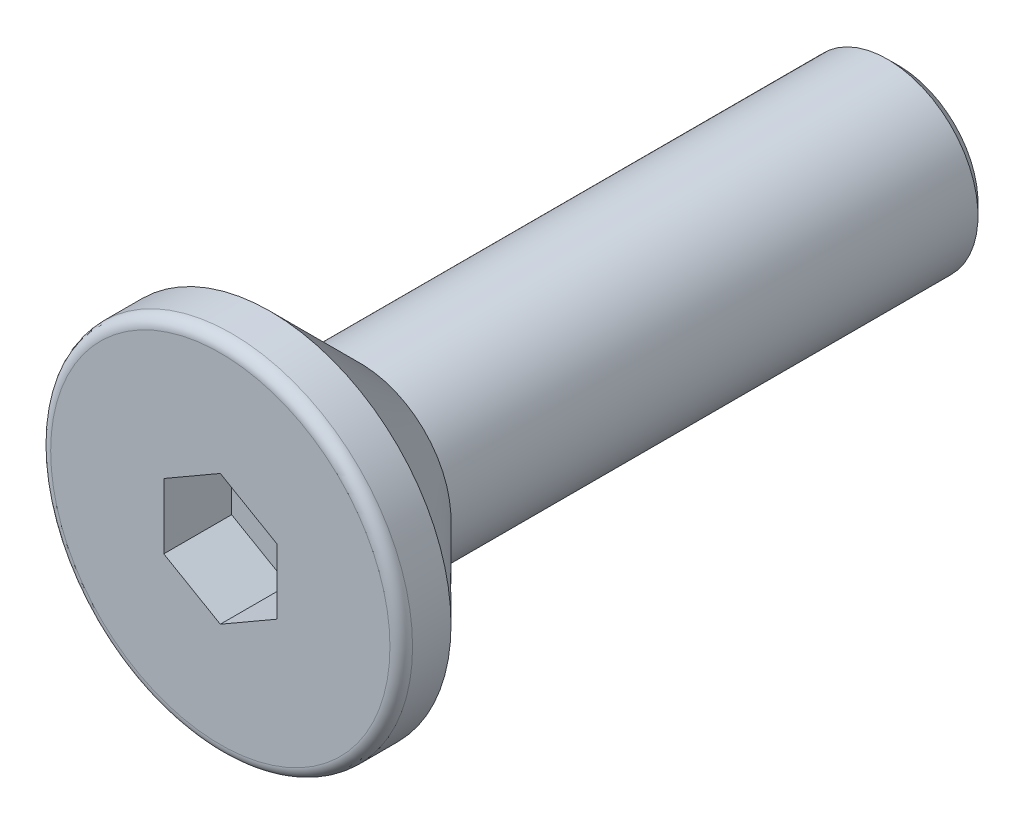
ISO-10303-21;
HEADER;
FILE_DESCRIPTION(('STEP AP214'),'2;1');
FILE_NAME('part.step','',(''),(''),'','','');
FILE_SCHEMA(('AUTOMOTIVE_DESIGN { 1 0 10303 214 1 1 1 1 }'));
ENDSEC;
DATA;
#1=APPLICATION_CONTEXT('core data for automotive mechanical design processes');
#2=APPLICATION_PROTOCOL_DEFINITION('international standard','automotive_design',2000,#1);
#3=PRODUCT_CONTEXT('',#1,'mechanical');
#4=PRODUCT('Part','Part','',(#3));
#5=PRODUCT_RELATED_PRODUCT_CATEGORY('part','',(#4));
#6=PRODUCT_DEFINITION_FORMATION('','',#4);
#7=PRODUCT_DEFINITION_CONTEXT('part definition',#1,'design');
#8=PRODUCT_DEFINITION('design','',#6,#7);
#9=PRODUCT_DEFINITION_SHAPE('','',#8);
#10=(LENGTH_UNIT() NAMED_UNIT(*) SI_UNIT(.MILLI.,.METRE.));
#11=(NAMED_UNIT(*) PLANE_ANGLE_UNIT() SI_UNIT($,.RADIAN.));
#12=(NAMED_UNIT(*) SI_UNIT($,.STERADIAN.) SOLID_ANGLE_UNIT());
#13=UNCERTAINTY_MEASURE_WITH_UNIT(LENGTH_MEASURE(1.E-05),#10,'distance_accuracy_value','');
#14=(GEOMETRIC_REPRESENTATION_CONTEXT(3) GLOBAL_UNCERTAINTY_ASSIGNED_CONTEXT((#13)) GLOBAL_UNIT_ASSIGNED_CONTEXT((#10,
#11,#12)) REPRESENTATION_CONTEXT('',''));
#15=CARTESIAN_POINT('',(0.,0.,0.));
#16=DIRECTION('',(0.,0.,1.));
#17=DIRECTION('',(1.,0.,0.));
#18=AXIS2_PLACEMENT_3D('',#15,#16,#17);
#19=CARTESIAN_POINT('',(0.,0.,15.));
#20=DIRECTION('',(0.,0.,1.));
#21=DIRECTION('',(1.,0.,0.));
#22=AXIS2_PLACEMENT_3D('',#19,#20,#21);
#23=PLANE('',#22);
#24=CARTESIAN_POINT('',(0.,0.,15.));
#25=DIRECTION('',(0.,0.,1.));
#26=DIRECTION('',(1.,0.,0.));
#27=AXIS2_PLACEMENT_3D('',#24,#25,#26);
#28=CIRCLE('',#27,7.5);
#29=CARTESIAN_POINT('',(7.5,0.,15.));
#30=VERTEX_POINT('',#29);
#31=EDGE_CURVE('E154',#30,#30,#28,.T.);
#32=ORIENTED_EDGE('',*,*,#31,.T.);
#33=EDGE_LOOP('',(#32));
#34=FACE_BOUND('',#33,.T.);
#35=DIRECTION('',(-0.866025403784439,0.5,0.));
#36=VECTOR('',#35,1.);
#37=CARTESIAN_POINT('',(2.5,1.44337567297407,15.));
#38=LINE('',#37,#36);
#39=CARTESIAN_POINT('',(2.5,1.44337567297407,15.));
#40=VERTEX_POINT('',#39);
#41=CARTESIAN_POINT('',(0.,2.88675134594813,15.));
#42=VERTEX_POINT('',#41);
#43=EDGE_CURVE('E53',#40,#42,#38,.T.);
#44=ORIENTED_EDGE('',*,*,#43,.F.);
#45=DIRECTION('',(0.,1.,0.));
#46=VECTOR('',#45,1.);
#47=CARTESIAN_POINT('',(2.5,-1.44337567297406,15.));
#48=LINE('',#47,#46);
#49=CARTESIAN_POINT('',(2.5,-1.44337567297406,15.));
#50=VERTEX_POINT('',#49);
#51=EDGE_CURVE('E136',#50,#40,#48,.T.);
#52=ORIENTED_EDGE('',*,*,#51,.F.);
#53=DIRECTION('',(0.866025403784439,0.5,0.));
#54=VECTOR('',#53,1.);
#55=CARTESIAN_POINT('',(0.,-2.88675134594813,15.));
#56=LINE('',#55,#54);
#57=CARTESIAN_POINT('',(0.,-2.88675134594813,15.));
#58=VERTEX_POINT('',#57);
#59=EDGE_CURVE('E134',#58,#50,#56,.T.);
#60=ORIENTED_EDGE('',*,*,#59,.F.);
#61=DIRECTION('',(0.866025403784439,-0.5,0.));
#62=VECTOR('',#61,1.);
#63=CARTESIAN_POINT('',(-2.5,-1.44337567297406,15.));
#64=LINE('',#63,#62);
#65=CARTESIAN_POINT('',(-2.5,-1.44337567297406,15.));
#66=VERTEX_POINT('',#65);
#67=EDGE_CURVE('E101',#66,#58,#64,.T.);
#68=ORIENTED_EDGE('',*,*,#67,.F.);
#69=DIRECTION('',(0.,-1.,0.));
#70=VECTOR('',#69,1.);
#71=CARTESIAN_POINT('',(-2.5,1.44337567297407,15.));
#72=LINE('',#71,#70);
#73=CARTESIAN_POINT('',(-2.5,1.44337567297407,15.));
#74=VERTEX_POINT('',#73);
#75=EDGE_CURVE('E130',#74,#66,#72,.T.);
#76=ORIENTED_EDGE('',*,*,#75,.F.);
#77=DIRECTION('',(-0.866025403784439,-0.5,0.));
#78=VECTOR('',#77,1.);
#79=CARTESIAN_POINT('',(0.,2.88675134594813,15.));
#80=LINE('',#79,#78);
#81=EDGE_CURVE('E127',#42,#74,#80,.T.);
#82=ORIENTED_EDGE('',*,*,#81,.F.);
#83=EDGE_LOOP('',(#44,#52,#60,#68,#76,#82));
#84=FACE_BOUND('',#83,.T.);
#85=ADVANCED_FACE('F37',(#34,#84),#23,.T.);
#86=CARTESIAN_POINT('',(0.,0.,-15.));
#87=DIRECTION('',(0.,0.,-1.));
#88=DIRECTION('',(-1.,0.,0.));
#89=AXIS2_PLACEMENT_3D('',#86,#87,#88);
#90=CYLINDRICAL_SURFACE('',#89,8.);
#91=CARTESIAN_POINT('',(0.,0.,14.5));
#92=DIRECTION('',(0.,0.,1.));
#93=DIRECTION('',(1.,0.,0.));
#94=AXIS2_PLACEMENT_3D('',#91,#92,#93);
#95=CIRCLE('',#94,8.);
#96=CARTESIAN_POINT('',(8.,0.,14.5));
#97=VERTEX_POINT('',#96);
#98=EDGE_CURVE('E151',#97,#97,#95,.F.);
#99=ORIENTED_EDGE('',*,*,#98,.T.);
#100=EDGE_LOOP('',(#99));
#101=FACE_BOUND('',#100,.T.);
#102=CARTESIAN_POINT('',(0.,0.,12.8));
#103=DIRECTION('',(0.,0.,-1.));
#104=DIRECTION('',(-1.,0.,0.));
#105=AXIS2_PLACEMENT_3D('',#102,#103,#104);
#106=CIRCLE('',#105,8.);
#107=CARTESIAN_POINT('',(-8.,0.,12.8));
#108=VERTEX_POINT('',#107);
#109=EDGE_CURVE('E148',#108,#108,#106,.T.);
#110=ORIENTED_EDGE('',*,*,#109,.F.);
#111=EDGE_LOOP('',(#110));
#112=FACE_BOUND('',#111,.T.);
#113=ADVANCED_FACE('F170',(#101,#112),#90,.T.);
#114=CARTESIAN_POINT('',(0.,0.,8.8));
#115=DIRECTION('',(0.,0.,1.));
#116=DIRECTION('',(1.,0.,0.));
#117=AXIS2_PLACEMENT_3D('',#114,#115,#116);
#118=CONICAL_SURFACE('',#117,4.,0.78539816339745);
#119=ORIENTED_EDGE('',*,*,#109,.T.);
#120=EDGE_LOOP('',(#119));
#121=FACE_BOUND('',#120,.T.);
#122=CARTESIAN_POINT('',(0.,0.,8.8));
#123=DIRECTION('',(0.,0.,-1.));
#124=DIRECTION('',(-1.,0.,0.));
#125=AXIS2_PLACEMENT_3D('',#122,#123,#124);
#126=CIRCLE('',#125,4.);
#127=CARTESIAN_POINT('',(-4.,0.,8.8));
#128=VERTEX_POINT('',#127);
#129=EDGE_CURVE('E140',#128,#128,#126,.T.);
#130=ORIENTED_EDGE('',*,*,#129,.F.);
#131=EDGE_LOOP('',(#130));
#132=FACE_BOUND('',#131,.T.);
#133=ADVANCED_FACE('F176',(#121,#132),#118,.T.);
#134=CARTESIAN_POINT('',(0.,0.,-15.));
#135=DIRECTION('',(0.,0.,-1.));
#136=DIRECTION('',(-1.,0.,0.));
#137=AXIS2_PLACEMENT_3D('',#134,#135,#136);
#138=CYLINDRICAL_SURFACE('',#137,4.);
#139=CARTESIAN_POINT('',(0.,0.,-14.5));
#140=DIRECTION('',(0.,0.,-1.));
#141=DIRECTION('',(-1.,0.,0.));
#142=AXIS2_PLACEMENT_3D('',#139,#140,#141);
#143=CIRCLE('',#142,4.);
#144=CARTESIAN_POINT('',(-4.,0.,-14.5));
#145=VERTEX_POINT('',#144);
#146=EDGE_CURVE('E11',#145,#145,#143,.F.);
#147=ORIENTED_EDGE('',*,*,#146,.T.);
#148=EDGE_LOOP('',(#147));
#149=FACE_BOUND('',#148,.T.);
#150=ORIENTED_EDGE('',*,*,#129,.T.);
#151=EDGE_LOOP('',(#150));
#152=FACE_BOUND('',#151,.T.);
#153=ADVANCED_FACE('F183',(#149,#152),#138,.T.);
#154=CARTESIAN_POINT('',(0.,4.,-15.));
#155=DIRECTION('',(0.,0.,-1.));
#156=DIRECTION('',(-1.,0.,0.));
#157=AXIS2_PLACEMENT_3D('',#154,#155,#156);
#158=PLANE('',#157);
#159=CARTESIAN_POINT('',(0.,0.,-15.));
#160=DIRECTION('',(0.,0.,-1.));
#161=DIRECTION('',(-1.,0.,0.));
#162=AXIS2_PLACEMENT_3D('',#159,#160,#161);
#163=CIRCLE('',#162,3.50000000000001);
#164=CARTESIAN_POINT('',(-3.50000000000001,0.,-15.));
#165=VERTEX_POINT('',#164);
#166=EDGE_CURVE('E46',#165,#165,#163,.T.);
#167=ORIENTED_EDGE('',*,*,#166,.T.);
#168=EDGE_LOOP('',(#167));
#169=FACE_BOUND('',#168,.T.);
#170=ADVANCED_FACE('F159',(#169),#158,.T.);
#171=CARTESIAN_POINT('',(2.5,1.44337567297407,12.));
#172=DIRECTION('',(0.5,0.866025403784439,0.));
#173=DIRECTION('',(-0.866025403784439,0.5,0.));
#174=AXIS2_PLACEMENT_3D('',#171,#172,#173);
#175=PLANE('',#174);
#176=ORIENTED_EDGE('',*,*,#43,.T.);
#177=DIRECTION('',(0.,0.,1.));
#178=VECTOR('',#177,1.);
#179=CARTESIAN_POINT('',(0.,2.88675134594813,12.));
#180=LINE('',#179,#178);
#181=CARTESIAN_POINT('',(0.,2.88675134594813,12.));
#182=VERTEX_POINT('',#181);
#183=EDGE_CURVE('E83',#182,#42,#180,.T.);
#184=ORIENTED_EDGE('',*,*,#183,.F.);
#185=DIRECTION('',(-0.866025403784439,0.5,0.));
#186=VECTOR('',#185,1.);
#187=CARTESIAN_POINT('',(2.5,1.44337567297407,12.));
#188=LINE('',#187,#186);
#189=CARTESIAN_POINT('',(2.5,1.44337567297407,12.));
#190=VERTEX_POINT('',#189);
#191=EDGE_CURVE('E138',#190,#182,#188,.T.);
#192=ORIENTED_EDGE('',*,*,#191,.F.);
#193=DIRECTION('',(0.,0.,1.));
#194=VECTOR('',#193,1.);
#195=CARTESIAN_POINT('',(2.5,1.44337567297407,12.));
#196=LINE('',#195,#194);
#197=EDGE_CURVE('E61',#190,#40,#196,.T.);
#198=ORIENTED_EDGE('',*,*,#197,.T.);
#199=EDGE_LOOP('',(#176,#184,#192,#198));
#200=FACE_BOUND('',#199,.T.);
#201=ADVANCED_FACE('F190',(#200),#175,.F.);
#202=CARTESIAN_POINT('',(2.5,-1.44337567297406,12.));
#203=DIRECTION('',(1.,0.,0.));
#204=DIRECTION('',(0.,1.,0.));
#205=AXIS2_PLACEMENT_3D('',#202,#203,#204);
#206=PLANE('',#205);
#207=ORIENTED_EDGE('',*,*,#51,.T.);
#208=ORIENTED_EDGE('',*,*,#197,.F.);
#209=DIRECTION('',(0.,1.,0.));
#210=VECTOR('',#209,1.);
#211=CARTESIAN_POINT('',(2.5,-1.44337567297406,12.));
#212=LINE('',#211,#210);
#213=CARTESIAN_POINT('',(2.5,-1.44337567297406,12.));
#214=VERTEX_POINT('',#213);
#215=EDGE_CURVE('E113',#214,#190,#212,.T.);
#216=ORIENTED_EDGE('',*,*,#215,.F.);
#217=DIRECTION('',(0.,0.,1.));
#218=VECTOR('',#217,1.);
#219=CARTESIAN_POINT('',(2.5,-1.44337567297406,12.));
#220=LINE('',#219,#218);
#221=EDGE_CURVE('E105',#214,#50,#220,.T.);
#222=ORIENTED_EDGE('',*,*,#221,.T.);
#223=EDGE_LOOP('',(#207,#208,#216,#222));
#224=FACE_BOUND('',#223,.T.);
#225=ADVANCED_FACE('F193',(#224),#206,.F.);
#226=CARTESIAN_POINT('',(0.,-2.88675134594813,12.));
#227=DIRECTION('',(0.5,-0.866025403784439,0.));
#228=DIRECTION('',(0.866025403784439,0.5,0.));
#229=AXIS2_PLACEMENT_3D('',#226,#227,#228);
#230=PLANE('',#229);
#231=ORIENTED_EDGE('',*,*,#59,.T.);
#232=ORIENTED_EDGE('',*,*,#221,.F.);
#233=DIRECTION('',(0.866025403784439,0.5,0.));
#234=VECTOR('',#233,1.);
#235=CARTESIAN_POINT('',(0.,-2.88675134594813,12.));
#236=LINE('',#235,#234);
#237=CARTESIAN_POINT('',(0.,-2.88675134594813,12.));
#238=VERTEX_POINT('',#237);
#239=EDGE_CURVE('E109',#238,#214,#236,.T.);
#240=ORIENTED_EDGE('',*,*,#239,.F.);
#241=DIRECTION('',(0.,0.,1.));
#242=VECTOR('',#241,1.);
#243=CARTESIAN_POINT('',(0.,-2.88675134594813,12.));
#244=LINE('',#243,#242);
#245=EDGE_CURVE('E94',#238,#58,#244,.T.);
#246=ORIENTED_EDGE('',*,*,#245,.T.);
#247=EDGE_LOOP('',(#231,#232,#240,#246));
#248=FACE_BOUND('',#247,.T.);
#249=ADVANCED_FACE('F110',(#248),#230,.F.);
#250=CARTESIAN_POINT('',(-2.5,-1.44337567297406,12.));
#251=DIRECTION('',(-0.5,-0.866025403784438,0.));
#252=DIRECTION('',(0.866025403784439,-0.5,0.));
#253=AXIS2_PLACEMENT_3D('',#250,#251,#252);
#254=PLANE('',#253);
#255=ORIENTED_EDGE('',*,*,#67,.T.);
#256=ORIENTED_EDGE('',*,*,#245,.F.);
#257=DIRECTION('',(0.866025403784439,-0.5,0.));
#258=VECTOR('',#257,1.);
#259=CARTESIAN_POINT('',(-2.5,-1.44337567297406,12.));
#260=LINE('',#259,#258);
#261=CARTESIAN_POINT('',(-2.5,-1.44337567297406,12.));
#262=VERTEX_POINT('',#261);
#263=EDGE_CURVE('E98',#262,#238,#260,.T.);
#264=ORIENTED_EDGE('',*,*,#263,.F.);
#265=DIRECTION('',(0.,0.,1.));
#266=VECTOR('',#265,1.);
#267=CARTESIAN_POINT('',(-2.5,-1.44337567297406,12.));
#268=LINE('',#267,#266);
#269=EDGE_CURVE('E106',#262,#66,#268,.T.);
#270=ORIENTED_EDGE('',*,*,#269,.T.);
#271=EDGE_LOOP('',(#255,#256,#264,#270));
#272=FACE_BOUND('',#271,.T.);
#273=ADVANCED_FACE('F96',(#272),#254,.F.);
#274=CARTESIAN_POINT('',(-2.5,1.44337567297407,12.));
#275=DIRECTION('',(-1.,0.,0.));
#276=DIRECTION('',(0.,0.,1.));
#277=AXIS2_PLACEMENT_3D('',#274,#275,#276);
#278=PLANE('',#277);
#279=ORIENTED_EDGE('',*,*,#75,.T.);
#280=ORIENTED_EDGE('',*,*,#269,.F.);
#281=DIRECTION('',(0.,-1.,0.));
#282=VECTOR('',#281,1.);
#283=CARTESIAN_POINT('',(-2.5,1.44337567297407,12.));
#284=LINE('',#283,#282);
#285=CARTESIAN_POINT('',(-2.5,1.44337567297407,12.));
#286=VERTEX_POINT('',#285);
#287=EDGE_CURVE('E119',#286,#262,#284,.T.);
#288=ORIENTED_EDGE('',*,*,#287,.F.);
#289=DIRECTION('',(0.,0.,1.));
#290=VECTOR('',#289,1.);
#291=CARTESIAN_POINT('',(-2.5,1.44337567297407,12.));
#292=LINE('',#291,#290);
#293=EDGE_CURVE('E143',#286,#74,#292,.T.);
#294=ORIENTED_EDGE('',*,*,#293,.T.);
#295=EDGE_LOOP('',(#279,#280,#288,#294));
#296=FACE_BOUND('',#295,.T.);
#297=ADVANCED_FACE('F197',(#296),#278,.F.);
#298=CARTESIAN_POINT('',(0.,2.88675134594813,12.));
#299=DIRECTION('',(-0.5,0.866025403784439,0.));
#300=DIRECTION('',(-0.866025403784439,-0.5,0.));
#301=AXIS2_PLACEMENT_3D('',#298,#299,#300);
#302=PLANE('',#301);
#303=ORIENTED_EDGE('',*,*,#81,.T.);
#304=ORIENTED_EDGE('',*,*,#293,.F.);
#305=DIRECTION('',(-0.866025403784439,-0.5,0.));
#306=VECTOR('',#305,1.);
#307=CARTESIAN_POINT('',(0.,2.88675134594813,12.));
#308=LINE('',#307,#306);
#309=EDGE_CURVE('E121',#182,#286,#308,.T.);
#310=ORIENTED_EDGE('',*,*,#309,.F.);
#311=ORIENTED_EDGE('',*,*,#183,.T.);
#312=EDGE_LOOP('',(#303,#304,#310,#311));
#313=FACE_BOUND('',#312,.T.);
#314=ADVANCED_FACE('F194',(#313),#302,.F.);
#315=CARTESIAN_POINT('',(0.,0.,12.));
#316=DIRECTION('',(0.,0.,1.));
#317=DIRECTION('',(1.,0.,0.));
#318=AXIS2_PLACEMENT_3D('',#315,#316,#317);
#319=PLANE('',#318);
#320=ORIENTED_EDGE('',*,*,#191,.T.);
#321=ORIENTED_EDGE('',*,*,#309,.T.);
#322=ORIENTED_EDGE('',*,*,#287,.T.);
#323=ORIENTED_EDGE('',*,*,#263,.T.);
#324=ORIENTED_EDGE('',*,*,#239,.T.);
#325=ORIENTED_EDGE('',*,*,#215,.T.);
#326=EDGE_LOOP('',(#320,#321,#322,#323,#324,#325));
#327=FACE_BOUND('',#326,.T.);
#328=ADVANCED_FACE('F116',(#327),#319,.T.);
#329=CARTESIAN_POINT('',(0.,0.,14.5));
#330=DIRECTION('',(0.,0.,1.));
#331=DIRECTION('',(1.,0.,0.));
#332=AXIS2_PLACEMENT_3D('',#329,#330,#331);
#333=TOROIDAL_SURFACE('',#332,7.5,0.5);
#334=ORIENTED_EDGE('',*,*,#31,.F.);
#335=EDGE_LOOP('',(#334));
#336=FACE_BOUND('',#335,.T.);
#337=ORIENTED_EDGE('',*,*,#98,.F.);
#338=EDGE_LOOP('',(#337));
#339=FACE_BOUND('',#338,.T.);
#340=ADVANCED_FACE('F162',(#336,#339),#333,.T.);
#341=CARTESIAN_POINT('',(0.,0.,-15.));
#342=DIRECTION('',(0.,0.,1.));
#343=DIRECTION('',(1.,0.,0.));
#344=AXIS2_PLACEMENT_3D('',#341,#342,#343);
#345=CONICAL_SURFACE('',#344,3.50000000000001,0.785398163397445);
#346=ORIENTED_EDGE('',*,*,#146,.F.);
#347=EDGE_LOOP('',(#346));
#348=FACE_BOUND('',#347,.T.);
#349=ORIENTED_EDGE('',*,*,#166,.F.);
#350=EDGE_LOOP('',(#349));
#351=FACE_BOUND('',#350,.T.);
#352=ADVANCED_FACE('F40',(#348,#351),#345,.T.);
#353=CLOSED_SHELL('',(#85,#113,#133,#153,#170,#201,#225,#249,#273,#297,#314,#328,#340,#352));
#354=MANIFOLD_SOLID_BREP('B2',#353);
#355=ADVANCED_BREP_SHAPE_REPRESENTATION('',(#18,#354),#14);
#356=SHAPE_DEFINITION_REPRESENTATION(#9,#355);
ENDSEC;
END-ISO-10303-21;
